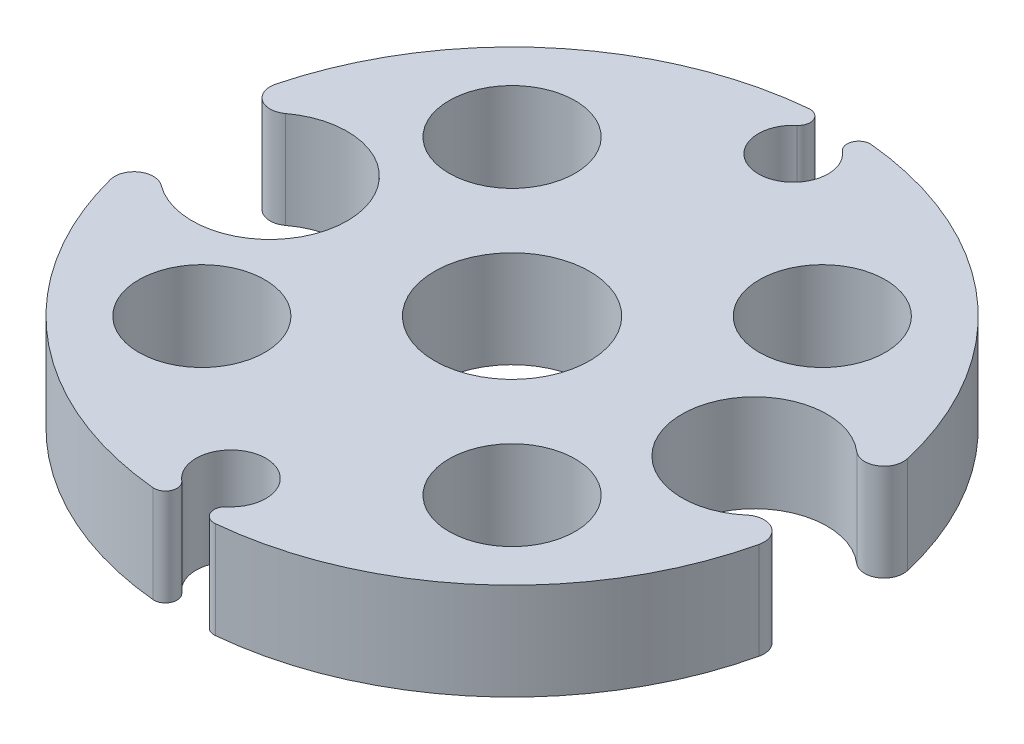
ISO-10303-21;
HEADER;
FILE_DESCRIPTION(('STEP AP214'),'2;1');
FILE_NAME('part.step','',(''),(''),'','','');
FILE_SCHEMA(('AUTOMOTIVE_DESIGN { 1 0 10303 214 1 1 1 1 }'));
ENDSEC;
DATA;
#1=APPLICATION_CONTEXT('core data for automotive mechanical design processes');
#2=APPLICATION_PROTOCOL_DEFINITION('international standard','automotive_design',2000,#1);
#3=PRODUCT_CONTEXT('',#1,'mechanical');
#4=PRODUCT('Part','Part','',(#3));
#5=PRODUCT_RELATED_PRODUCT_CATEGORY('part','',(#4));
#6=PRODUCT_DEFINITION_FORMATION('','',#4);
#7=PRODUCT_DEFINITION_CONTEXT('part definition',#1,'design');
#8=PRODUCT_DEFINITION('design','',#6,#7);
#9=PRODUCT_DEFINITION_SHAPE('','',#8);
#10=(LENGTH_UNIT() NAMED_UNIT(*) SI_UNIT(.MILLI.,.METRE.));
#11=(NAMED_UNIT(*) PLANE_ANGLE_UNIT() SI_UNIT($,.RADIAN.));
#12=(NAMED_UNIT(*) SI_UNIT($,.STERADIAN.) SOLID_ANGLE_UNIT());
#13=UNCERTAINTY_MEASURE_WITH_UNIT(LENGTH_MEASURE(1.E-05),#10,'distance_accuracy_value','');
#14=(GEOMETRIC_REPRESENTATION_CONTEXT(3) GLOBAL_UNCERTAINTY_ASSIGNED_CONTEXT((#13)) GLOBAL_UNIT_ASSIGNED_CONTEXT((#10,
#11,#12)) REPRESENTATION_CONTEXT('',''));
#15=CARTESIAN_POINT('',(0.,0.,0.));
#16=DIRECTION('',(0.,0.,1.));
#17=DIRECTION('',(1.,0.,0.));
#18=AXIS2_PLACEMENT_3D('',#15,#16,#17);
#19=CARTESIAN_POINT('',(90.5251235922764,5.,-81.0968706266902));
#20=DIRECTION('',(0.,-1.,0.));
#21=DIRECTION('',(0.,0.,-1.));
#22=AXIS2_PLACEMENT_3D('',#19,#20,#21);
#23=CYLINDRICAL_SURFACE('',#22,0.599999999999982);
#24=CARTESIAN_POINT('',(90.5251235922764,0.,-81.0968706266902));
#25=DIRECTION('',(0.,1.,0.));
#26=DIRECTION('',(0.,0.,1.));
#27=AXIS2_PLACEMENT_3D('',#24,#25,#26);
#28=CIRCLE('',#27,0.599999999999982);
#29=CARTESIAN_POINT('',(90.1357147690975,0.,-81.5533361439316));
#30=VERTEX_POINT('',#29);
#31=CARTESIAN_POINT('',(90.5821102493269,0.,-80.4995829900207));
#32=VERTEX_POINT('',#31);
#33=EDGE_CURVE('E196',#30,#32,#28,.T.);
#34=ORIENTED_EDGE('',*,*,#33,.T.);
#35=DIRECTION('',(0.,-1.,0.));
#36=VECTOR('',#35,1.);
#37=CARTESIAN_POINT('',(90.5821102493269,5.,-80.4995829900207));
#38=LINE('',#37,#36);
#39=CARTESIAN_POINT('',(90.5821102493269,5.,-80.4995829900207));
#40=VERTEX_POINT('',#39);
#41=EDGE_CURVE('E11',#40,#32,#38,.T.);
#42=ORIENTED_EDGE('',*,*,#41,.F.);
#43=CARTESIAN_POINT('',(90.5251235922764,5.,-81.0968706266902));
#44=DIRECTION('',(0.,1.,0.));
#45=DIRECTION('',(0.,0.,1.));
#46=AXIS2_PLACEMENT_3D('',#43,#44,#45);
#47=CIRCLE('',#46,0.599999999999982);
#48=CARTESIAN_POINT('',(90.1357147690975,5.,-81.5533361439316));
#49=VERTEX_POINT('',#48);
#50=EDGE_CURVE('E284',#49,#40,#47,.T.);
#51=ORIENTED_EDGE('',*,*,#50,.F.);
#52=DIRECTION('',(0.,-1.,0.));
#53=VECTOR('',#52,1.);
#54=CARTESIAN_POINT('',(90.1357147690975,5.,-81.5533361439316));
#55=LINE('',#54,#53);
#56=EDGE_CURVE('E51',#49,#30,#55,.T.);
#57=ORIENTED_EDGE('',*,*,#56,.T.);
#58=EDGE_LOOP('',(#34,#42,#51,#57));
#59=FACE_BOUND('',#58,.T.);
#60=ADVANCED_FACE('F34',(#59),#23,.T.);
#61=CARTESIAN_POINT('',(88.9674882995609,5.,-97.4227326956557));
#62=DIRECTION('',(0.,-1.,0.));
#63=DIRECTION('',(0.,0.,-1.));
#64=AXIS2_PLACEMENT_3D('',#61,#62,#63);
#65=CYLINDRICAL_SURFACE('',#64,17.);
#66=CARTESIAN_POINT('',(88.9674882995609,0.,-97.4227326956557));
#67=DIRECTION('',(0.,1.,0.));
#68=DIRECTION('',(0.,0.,1.));
#69=AXIS2_PLACEMENT_3D('',#66,#67,#68);
#70=CIRCLE('',#69,17.);
#71=CARTESIAN_POINT('',(105.532711055206,0.,-93.6026024549645));
#72=VERTEX_POINT('',#71);
#73=EDGE_CURVE('E198',#32,#72,#70,.T.);
#74=ORIENTED_EDGE('',*,*,#73,.T.);
#75=DIRECTION('',(0.,-1.,0.));
#76=VECTOR('',#75,1.);
#77=CARTESIAN_POINT('',(105.532711055206,5.,-93.6026024549645));
#78=LINE('',#77,#76);
#79=CARTESIAN_POINT('',(105.532711055206,5.,-93.6026024549645));
#80=VERTEX_POINT('',#79);
#81=EDGE_CURVE('E43',#80,#72,#78,.T.);
#82=ORIENTED_EDGE('',*,*,#81,.F.);
#83=CARTESIAN_POINT('',(88.9674882995609,5.,-97.4227326956557));
#84=DIRECTION('',(0.,1.,0.));
#85=DIRECTION('',(0.,0.,1.));
#86=AXIS2_PLACEMENT_3D('',#83,#84,#85);
#87=CIRCLE('',#86,17.);
#88=EDGE_CURVE('E114',#40,#80,#87,.T.);
#89=ORIENTED_EDGE('',*,*,#88,.F.);
#90=ORIENTED_EDGE('',*,*,#41,.T.);
#91=EDGE_LOOP('',(#74,#82,#89,#90));
#92=FACE_BOUND('',#91,.T.);
#93=ADVANCED_FACE('F268',(#92),#65,.T.);
#94=CARTESIAN_POINT('',(104.558286187227,5.,-93.8273159985346));
#95=DIRECTION('',(0.,-1.,0.));
#96=DIRECTION('',(0.,0.,-1.));
#97=AXIS2_PLACEMENT_3D('',#94,#95,#96);
#98=CYLINDRICAL_SURFACE('',#97,1.);
#99=CARTESIAN_POINT('',(104.558286187227,0.,-93.8273159985346));
#100=DIRECTION('',(0.,1.,0.));
#101=DIRECTION('',(0.,0.,1.));
#102=AXIS2_PLACEMENT_3D('',#99,#100,#101);
#103=CIRCLE('',#102,1.);
#104=CARTESIAN_POINT('',(103.906399753367,0.,-94.5856326061263));
#105=VERTEX_POINT('',#104);
#106=EDGE_CURVE('E201',#105,#72,#103,.F.);
#107=ORIENTED_EDGE('',*,*,#106,.F.);
#108=DIRECTION('',(0.,-1.,0.));
#109=VECTOR('',#108,1.);
#110=CARTESIAN_POINT('',(103.906399753367,5.,-94.5856326061263));
#111=LINE('',#110,#109);
#112=CARTESIAN_POINT('',(103.906399753367,5.,-94.5856326061263));
#113=VERTEX_POINT('',#112);
#114=EDGE_CURVE('E261',#113,#105,#111,.T.);
#115=ORIENTED_EDGE('',*,*,#114,.F.);
#116=CARTESIAN_POINT('',(104.558286187227,5.,-93.8273159985346));
#117=DIRECTION('',(0.,1.,0.));
#118=DIRECTION('',(0.,0.,1.));
#119=AXIS2_PLACEMENT_3D('',#116,#117,#118);
#120=CIRCLE('',#119,1.);
#121=EDGE_CURVE('E267',#113,#80,#120,.F.);
#122=ORIENTED_EDGE('',*,*,#121,.T.);
#123=ORIENTED_EDGE('',*,*,#81,.T.);
#124=EDGE_LOOP('',(#107,#115,#122,#123));
#125=FACE_BOUND('',#124,.T.);
#126=ADVANCED_FACE('F265',(#125),#98,.T.);
#127=CARTESIAN_POINT('',(101.467488299561,5.,-97.4227326956558));
#128=DIRECTION('',(0.,-1.,0.));
#129=DIRECTION('',(0.,0.,-1.));
#130=AXIS2_PLACEMENT_3D('',#127,#128,#129);
#131=CYLINDRICAL_SURFACE('',#130,3.74131340541217);
#132=CARTESIAN_POINT('',(101.467488299561,0.,-97.4227326956558));
#133=DIRECTION('',(0.,1.,0.));
#134=DIRECTION('',(0.,0.,1.));
#135=AXIS2_PLACEMENT_3D('',#132,#133,#134);
#136=CIRCLE('',#135,3.74131340541217);
#137=CARTESIAN_POINT('',(103.906399753367,0.,-100.259832785185));
#138=VERTEX_POINT('',#137);
#139=EDGE_CURVE('E204',#138,#105,#136,.T.);
#140=ORIENTED_EDGE('',*,*,#139,.F.);
#141=DIRECTION('',(0.,-1.,0.));
#142=VECTOR('',#141,1.);
#143=CARTESIAN_POINT('',(103.906399753367,5.,-100.259832785185));
#144=LINE('',#143,#142);
#145=CARTESIAN_POINT('',(103.906399753367,5.,-100.259832785185));
#146=VERTEX_POINT('',#145);
#147=EDGE_CURVE('E259',#146,#138,#144,.T.);
#148=ORIENTED_EDGE('',*,*,#147,.F.);
#149=CARTESIAN_POINT('',(101.467488299561,5.,-97.4227326956558));
#150=DIRECTION('',(0.,1.,0.));
#151=DIRECTION('',(0.,0.,1.));
#152=AXIS2_PLACEMENT_3D('',#149,#150,#151);
#153=CIRCLE('',#152,3.74131340541217);
#154=EDGE_CURVE('E280',#146,#113,#153,.T.);
#155=ORIENTED_EDGE('',*,*,#154,.T.);
#156=ORIENTED_EDGE('',*,*,#114,.T.);
#157=EDGE_LOOP('',(#140,#148,#155,#156));
#158=FACE_BOUND('',#157,.T.);
#159=ADVANCED_FACE('F276',(#158),#131,.F.);
#160=CARTESIAN_POINT('',(104.558286187227,5.,-101.018149392777));
#161=DIRECTION('',(0.,-1.,0.));
#162=DIRECTION('',(0.,0.,-1.));
#163=AXIS2_PLACEMENT_3D('',#160,#161,#162);
#164=CYLINDRICAL_SURFACE('',#163,0.999999999999882);
#165=CARTESIAN_POINT('',(104.558286187227,0.,-101.018149392777));
#166=DIRECTION('',(0.,1.,0.));
#167=DIRECTION('',(0.,0.,1.));
#168=AXIS2_PLACEMENT_3D('',#165,#166,#167);
#169=CIRCLE('',#168,0.999999999999882);
#170=CARTESIAN_POINT('',(105.532711055206,0.,-101.242862936347));
#171=VERTEX_POINT('',#170);
#172=EDGE_CURVE('E207',#138,#171,#169,.T.);
#173=ORIENTED_EDGE('',*,*,#172,.T.);
#174=DIRECTION('',(0.,-1.,0.));
#175=VECTOR('',#174,1.);
#176=CARTESIAN_POINT('',(105.532711055206,5.,-101.242862936347));
#177=LINE('',#176,#175);
#178=CARTESIAN_POINT('',(105.532711055206,5.,-101.242862936347));
#179=VERTEX_POINT('',#178);
#180=EDGE_CURVE('E256',#179,#171,#177,.T.);
#181=ORIENTED_EDGE('',*,*,#180,.F.);
#182=CARTESIAN_POINT('',(104.558286187227,5.,-101.018149392777));
#183=DIRECTION('',(0.,1.,0.));
#184=DIRECTION('',(0.,0.,1.));
#185=AXIS2_PLACEMENT_3D('',#182,#183,#184);
#186=CIRCLE('',#185,0.999999999999882);
#187=EDGE_CURVE('E282',#146,#179,#186,.T.);
#188=ORIENTED_EDGE('',*,*,#187,.F.);
#189=ORIENTED_EDGE('',*,*,#147,.T.);
#190=EDGE_LOOP('',(#173,#181,#188,#189));
#191=FACE_BOUND('',#190,.T.);
#192=ADVANCED_FACE('F495',(#191),#164,.T.);
#193=CARTESIAN_POINT('',(88.9674882995609,5.,-97.4227326956557));
#194=DIRECTION('',(0.,-1.,0.));
#195=DIRECTION('',(0.,0.,-1.));
#196=AXIS2_PLACEMENT_3D('',#193,#194,#195);
#197=CYLINDRICAL_SURFACE('',#196,17.);
#198=CARTESIAN_POINT('',(88.9674882995609,0.,-97.4227326956557));
#199=DIRECTION('',(0.,1.,0.));
#200=DIRECTION('',(0.,0.,1.));
#201=AXIS2_PLACEMENT_3D('',#198,#199,#200);
#202=CIRCLE('',#201,17.);
#203=CARTESIAN_POINT('',(90.5702736876257,0.,-114.34700753979));
#204=VERTEX_POINT('',#203);
#205=EDGE_CURVE('E209',#171,#204,#202,.T.);
#206=ORIENTED_EDGE('',*,*,#205,.T.);
#207=DIRECTION('',(0.,-1.,0.));
#208=VECTOR('',#207,1.);
#209=CARTESIAN_POINT('',(90.5702736876257,5.,-114.34700753979));
#210=LINE('',#209,#208);
#211=CARTESIAN_POINT('',(90.5702736876257,5.,-114.34700753979));
#212=VERTEX_POINT('',#211);
#213=EDGE_CURVE('E253',#212,#204,#210,.T.);
#214=ORIENTED_EDGE('',*,*,#213,.F.);
#215=CARTESIAN_POINT('',(88.9674882995609,5.,-97.4227326956557));
#216=DIRECTION('',(0.,1.,0.));
#217=DIRECTION('',(0.,0.,1.));
#218=AXIS2_PLACEMENT_3D('',#215,#216,#217);
#219=CIRCLE('',#218,17.);
#220=EDGE_CURVE('E289',#179,#212,#219,.T.);
#221=ORIENTED_EDGE('',*,*,#220,.F.);
#222=ORIENTED_EDGE('',*,*,#180,.T.);
#223=EDGE_LOOP('',(#206,#214,#221,#222));
#224=FACE_BOUND('',#223,.T.);
#225=ADVANCED_FACE('F486',(#224),#197,.T.);
#226=CARTESIAN_POINT('',(90.5140447705068,5.,-113.753270128286));
#227=DIRECTION('',(0.,-1.,0.));
#228=DIRECTION('',(0.,0.,-1.));
#229=AXIS2_PLACEMENT_3D('',#226,#227,#228);
#230=CYLINDRICAL_SURFACE('',#229,0.596394001428948);
#231=CARTESIAN_POINT('',(90.5140447705068,0.,-113.753270128286));
#232=DIRECTION('',(0.,1.,0.));
#233=DIRECTION('',(0.,0.,1.));
#234=AXIS2_PLACEMENT_3D('',#231,#232,#233);
#235=CIRCLE('',#234,0.596394001428948);
#236=CARTESIAN_POINT('',(90.1291510503618,0.,-113.297701660179));
#237=VERTEX_POINT('',#236);
#238=EDGE_CURVE('E211',#204,#237,#235,.T.);
#239=ORIENTED_EDGE('',*,*,#238,.T.);
#240=DIRECTION('',(0.,-1.,0.));
#241=VECTOR('',#240,1.);
#242=CARTESIAN_POINT('',(90.1291510503618,5.,-113.297701660179));
#243=LINE('',#242,#241);
#244=CARTESIAN_POINT('',(90.1291510503618,5.,-113.297701660179));
#245=VERTEX_POINT('',#244);
#246=EDGE_CURVE('E251',#245,#237,#243,.T.);
#247=ORIENTED_EDGE('',*,*,#246,.F.);
#248=CARTESIAN_POINT('',(90.5140447705068,5.,-113.753270128286));
#249=DIRECTION('',(0.,1.,0.));
#250=DIRECTION('',(0.,0.,1.));
#251=AXIS2_PLACEMENT_3D('',#248,#249,#250);
#252=CIRCLE('',#251,0.596394001428948);
#253=EDGE_CURVE('E291',#212,#245,#252,.T.);
#254=ORIENTED_EDGE('',*,*,#253,.F.);
#255=ORIENTED_EDGE('',*,*,#213,.T.);
#256=EDGE_LOOP('',(#239,#247,#254,#255));
#257=FACE_BOUND('',#256,.T.);
#258=ADVANCED_FACE('F477',(#257),#230,.T.);
#259=CARTESIAN_POINT('',(88.9674882995609,5.,-111.922732695656));
#260=DIRECTION('',(0.,-1.,0.));
#261=DIRECTION('',(0.,0.,-1.));
#262=AXIS2_PLACEMENT_3D('',#259,#260,#261);
#263=CYLINDRICAL_SURFACE('',#262,1.8);
#264=CARTESIAN_POINT('',(88.9674882995609,0.,-111.922732695656));
#265=DIRECTION('',(0.,1.,0.));
#266=DIRECTION('',(0.,0.,1.));
#267=AXIS2_PLACEMENT_3D('',#264,#265,#266);
#268=CIRCLE('',#267,1.8);
#269=CARTESIAN_POINT('',(87.7992618300242,0.,-113.29212924738));
#270=VERTEX_POINT('',#269);
#271=EDGE_CURVE('E214',#270,#237,#268,.T.);
#272=ORIENTED_EDGE('',*,*,#271,.F.);
#273=DIRECTION('',(0.,-1.,0.));
#274=VECTOR('',#273,1.);
#275=CARTESIAN_POINT('',(87.7992618300242,5.,-113.29212924738));
#276=LINE('',#275,#274);
#277=CARTESIAN_POINT('',(87.7992618300242,5.,-113.29212924738));
#278=VERTEX_POINT('',#277);
#279=EDGE_CURVE('E249',#278,#270,#276,.T.);
#280=ORIENTED_EDGE('',*,*,#279,.F.);
#281=CARTESIAN_POINT('',(88.9674882995609,5.,-111.922732695656));
#282=DIRECTION('',(0.,1.,0.));
#283=DIRECTION('',(0.,0.,1.));
#284=AXIS2_PLACEMENT_3D('',#281,#282,#283);
#285=CIRCLE('',#284,1.8);
#286=EDGE_CURVE('E293',#278,#245,#285,.T.);
#287=ORIENTED_EDGE('',*,*,#286,.T.);
#288=ORIENTED_EDGE('',*,*,#246,.T.);
#289=EDGE_LOOP('',(#272,#280,#287,#288));
#290=FACE_BOUND('',#289,.T.);
#291=ADVANCED_FACE('F468',(#290),#263,.F.);
#292=CARTESIAN_POINT('',(87.4098530068454,5.,-113.748594764621));
#293=DIRECTION('',(0.,-1.,0.));
#294=DIRECTION('',(0.,0.,-1.));
#295=AXIS2_PLACEMENT_3D('',#292,#293,#294);
#296=CYLINDRICAL_SURFACE('',#295,0.600000000000002);
#297=CARTESIAN_POINT('',(87.4098530068454,0.,-113.748594764621));
#298=DIRECTION('',(0.,1.,0.));
#299=DIRECTION('',(0.,0.,1.));
#300=AXIS2_PLACEMENT_3D('',#297,#298,#299);
#301=CIRCLE('',#300,0.600000000000002);
#302=CARTESIAN_POINT('',(87.3528663497948,0.,-114.345882401291));
#303=VERTEX_POINT('',#302);
#304=EDGE_CURVE('E217',#270,#303,#301,.T.);
#305=ORIENTED_EDGE('',*,*,#304,.T.);
#306=DIRECTION('',(0.,-1.,0.));
#307=VECTOR('',#306,1.);
#308=CARTESIAN_POINT('',(87.3528663497948,5.,-114.345882401291));
#309=LINE('',#308,#307);
#310=CARTESIAN_POINT('',(87.3528663497948,5.,-114.345882401291));
#311=VERTEX_POINT('',#310);
#312=EDGE_CURVE('E246',#311,#303,#309,.T.);
#313=ORIENTED_EDGE('',*,*,#312,.F.);
#314=CARTESIAN_POINT('',(87.4098530068454,5.,-113.748594764621));
#315=DIRECTION('',(0.,1.,0.));
#316=DIRECTION('',(0.,0.,1.));
#317=AXIS2_PLACEMENT_3D('',#314,#315,#316);
#318=CIRCLE('',#317,0.600000000000002);
#319=EDGE_CURVE('E296',#278,#311,#318,.T.);
#320=ORIENTED_EDGE('',*,*,#319,.F.);
#321=ORIENTED_EDGE('',*,*,#279,.T.);
#322=EDGE_LOOP('',(#305,#313,#320,#321));
#323=FACE_BOUND('',#322,.T.);
#324=ADVANCED_FACE('F459',(#323),#296,.T.);
#325=CARTESIAN_POINT('',(88.9674882995609,5.,-97.4227326956557));
#326=DIRECTION('',(0.,-1.,0.));
#327=DIRECTION('',(0.,0.,-1.));
#328=AXIS2_PLACEMENT_3D('',#325,#326,#327);
#329=CYLINDRICAL_SURFACE('',#328,17.);
#330=CARTESIAN_POINT('',(88.9674882995609,0.,-97.4227326956557));
#331=DIRECTION('',(0.,1.,0.));
#332=DIRECTION('',(0.,0.,1.));
#333=AXIS2_PLACEMENT_3D('',#330,#331,#332);
#334=CIRCLE('',#333,17.);
#335=CARTESIAN_POINT('',(72.509363299561,0.,-101.68068073249));
#336=VERTEX_POINT('',#335);
#337=EDGE_CURVE('E219',#303,#336,#334,.T.);
#338=ORIENTED_EDGE('',*,*,#337,.T.);
#339=DIRECTION('',(0.,-1.,0.));
#340=VECTOR('',#339,1.);
#341=CARTESIAN_POINT('',(72.509363299561,5.,-101.68068073249));
#342=LINE('',#341,#340);
#343=CARTESIAN_POINT('',(72.509363299561,5.,-101.68068073249));
#344=VERTEX_POINT('',#343);
#345=EDGE_CURVE('E244',#344,#336,#342,.T.);
#346=ORIENTED_EDGE('',*,*,#345,.F.);
#347=CARTESIAN_POINT('',(88.9674882995609,5.,-97.4227326956557));
#348=DIRECTION('',(0.,1.,0.));
#349=DIRECTION('',(0.,0.,1.));
#350=AXIS2_PLACEMENT_3D('',#347,#348,#349);
#351=CIRCLE('',#350,17.);
#352=EDGE_CURVE('E298',#311,#344,#351,.T.);
#353=ORIENTED_EDGE('',*,*,#352,.F.);
#354=ORIENTED_EDGE('',*,*,#312,.T.);
#355=EDGE_LOOP('',(#338,#346,#353,#354));
#356=FACE_BOUND('',#355,.T.);
#357=ADVANCED_FACE('F451',(#356),#329,.T.);
#358=CARTESIAN_POINT('',(73.4774882995613,5.,-101.430213200911));
#359=DIRECTION('',(0.,-1.,0.));
#360=DIRECTION('',(0.,0.,-1.));
#361=AXIS2_PLACEMENT_3D('',#358,#359,#360);
#362=CYLINDRICAL_SURFACE('',#361,1.00000000000026);
#363=CARTESIAN_POINT('',(73.4774882995613,0.,-101.430213200911));
#364=DIRECTION('',(0.,1.,0.));
#365=DIRECTION('',(0.,0.,1.));
#366=AXIS2_PLACEMENT_3D('',#363,#364,#365);
#367=CIRCLE('',#366,1.00000000000026);
#368=CARTESIAN_POINT('',(74.0754882995613,0.,-100.62871709986));
#369=VERTEX_POINT('',#368);
#370=EDGE_CURVE('E222',#369,#336,#367,.F.);
#371=ORIENTED_EDGE('',*,*,#370,.F.);
#372=DIRECTION('',(0.,-1.,0.));
#373=VECTOR('',#372,1.);
#374=CARTESIAN_POINT('',(74.0754882995613,5.,-100.62871709986));
#375=LINE('',#374,#373);
#376=CARTESIAN_POINT('',(74.0754882995613,5.,-100.62871709986));
#377=VERTEX_POINT('',#376);
#378=EDGE_CURVE('E242',#377,#369,#375,.T.);
#379=ORIENTED_EDGE('',*,*,#378,.F.);
#380=CARTESIAN_POINT('',(73.4774882995613,5.,-101.430213200911));
#381=DIRECTION('',(0.,1.,0.));
#382=DIRECTION('',(0.,0.,1.));
#383=AXIS2_PLACEMENT_3D('',#380,#381,#382);
#384=CIRCLE('',#383,1.00000000000026);
#385=EDGE_CURVE('E300',#377,#344,#384,.F.);
#386=ORIENTED_EDGE('',*,*,#385,.T.);
#387=ORIENTED_EDGE('',*,*,#345,.T.);
#388=EDGE_LOOP('',(#371,#379,#386,#387));
#389=FACE_BOUND('',#388,.T.);
#390=ADVANCED_FACE('F313',(#389),#362,.T.);
#391=CARTESIAN_POINT('',(76.4674882995608,5.,-97.4227326956557));
#392=DIRECTION('',(0.,-1.,0.));
#393=DIRECTION('',(0.,0.,-1.));
#394=AXIS2_PLACEMENT_3D('',#391,#392,#393);
#395=CYLINDRICAL_SURFACE('',#394,3.99999999999998);
#396=CARTESIAN_POINT('',(76.4674882995608,0.,-97.4227326956557));
#397=DIRECTION('',(0.,1.,0.));
#398=DIRECTION('',(0.,0.,1.));
#399=AXIS2_PLACEMENT_3D('',#396,#397,#398);
#400=CIRCLE('',#399,3.99999999999998);
#401=CARTESIAN_POINT('',(74.0754882995617,0.,-94.216748291451));
#402=VERTEX_POINT('',#401);
#403=EDGE_CURVE('E225',#402,#369,#400,.T.);
#404=ORIENTED_EDGE('',*,*,#403,.F.);
#405=DIRECTION('',(0.,-1.,0.));
#406=VECTOR('',#405,1.);
#407=CARTESIAN_POINT('',(74.0754882995617,5.,-94.216748291451));
#408=LINE('',#407,#406);
#409=CARTESIAN_POINT('',(74.0754882995617,5.,-94.216748291451));
#410=VERTEX_POINT('',#409);
#411=EDGE_CURVE('E240',#410,#402,#408,.T.);
#412=ORIENTED_EDGE('',*,*,#411,.F.);
#413=CARTESIAN_POINT('',(76.4674882995608,5.,-97.4227326956557));
#414=DIRECTION('',(0.,1.,0.));
#415=DIRECTION('',(0.,0.,1.));
#416=AXIS2_PLACEMENT_3D('',#413,#414,#415);
#417=CIRCLE('',#416,3.99999999999998);
#418=EDGE_CURVE('E303',#410,#377,#417,.T.);
#419=ORIENTED_EDGE('',*,*,#418,.T.);
#420=ORIENTED_EDGE('',*,*,#378,.T.);
#421=EDGE_LOOP('',(#404,#412,#419,#420));
#422=FACE_BOUND('',#421,.T.);
#423=ADVANCED_FACE('F307',(#422),#395,.F.);
#424=CARTESIAN_POINT('',(73.4774882995616,5.,-93.4152521903994));
#425=DIRECTION('',(0.,-1.,0.));
#426=DIRECTION('',(0.,0.,-1.));
#427=AXIS2_PLACEMENT_3D('',#424,#425,#426);
#428=CYLINDRICAL_SURFACE('',#427,1.00000000000045);
#429=CARTESIAN_POINT('',(73.4774882995616,0.,-93.4152521903994));
#430=DIRECTION('',(0.,1.,0.));
#431=DIRECTION('',(0.,0.,1.));
#432=AXIS2_PLACEMENT_3D('',#429,#430,#431);
#433=CIRCLE('',#432,1.00000000000045);
#434=CARTESIAN_POINT('',(72.5093632995612,0.,-93.1647846588208));
#435=VERTEX_POINT('',#434);
#436=EDGE_CURVE('E228',#402,#435,#433,.T.);
#437=ORIENTED_EDGE('',*,*,#436,.T.);
#438=DIRECTION('',(0.,-1.,0.));
#439=VECTOR('',#438,1.);
#440=CARTESIAN_POINT('',(72.5093632995612,5.,-93.1647846588208));
#441=LINE('',#440,#439);
#442=CARTESIAN_POINT('',(72.5093632995612,5.,-93.1647846588208));
#443=VERTEX_POINT('',#442);
#444=EDGE_CURVE('E173',#443,#435,#441,.T.);
#445=ORIENTED_EDGE('',*,*,#444,.F.);
#446=CARTESIAN_POINT('',(73.4774882995616,5.,-93.4152521903994));
#447=DIRECTION('',(0.,1.,0.));
#448=DIRECTION('',(0.,0.,1.));
#449=AXIS2_PLACEMENT_3D('',#446,#447,#448);
#450=CIRCLE('',#449,1.00000000000045);
#451=EDGE_CURVE('E161',#410,#443,#450,.T.);
#452=ORIENTED_EDGE('',*,*,#451,.F.);
#453=ORIENTED_EDGE('',*,*,#411,.T.);
#454=EDGE_LOOP('',(#437,#445,#452,#453));
#455=FACE_BOUND('',#454,.T.);
#456=ADVANCED_FACE('F317',(#455),#428,.T.);
#457=CARTESIAN_POINT('',(88.9674882995609,5.,-97.4227326956557));
#458=DIRECTION('',(0.,-1.,0.));
#459=DIRECTION('',(0.,0.,-1.));
#460=AXIS2_PLACEMENT_3D('',#457,#458,#459);
#461=CYLINDRICAL_SURFACE('',#460,17.);
#462=CARTESIAN_POINT('',(88.9674882995609,0.,-97.4227326956557));
#463=DIRECTION('',(0.,1.,0.));
#464=DIRECTION('',(0.,0.,1.));
#465=AXIS2_PLACEMENT_3D('',#462,#463,#464);
#466=CIRCLE('',#465,17.);
#467=CARTESIAN_POINT('',(87.3647029114961,0.,-80.4984578515212));
#468=VERTEX_POINT('',#467);
#469=EDGE_CURVE('E170',#435,#468,#466,.T.);
#470=ORIENTED_EDGE('',*,*,#469,.T.);
#471=DIRECTION('',(0.,-1.,0.));
#472=VECTOR('',#471,1.);
#473=CARTESIAN_POINT('',(87.3647029114961,5.,-80.4984578515212));
#474=LINE('',#473,#472);
#475=CARTESIAN_POINT('',(87.3647029114961,5.,-80.4984578515212));
#476=VERTEX_POINT('',#475);
#477=EDGE_CURVE('E167',#476,#468,#474,.T.);
#478=ORIENTED_EDGE('',*,*,#477,.F.);
#479=CARTESIAN_POINT('',(88.9674882995609,5.,-97.4227326956557));
#480=DIRECTION('',(0.,1.,0.));
#481=DIRECTION('',(0.,0.,1.));
#482=AXIS2_PLACEMENT_3D('',#479,#480,#481);
#483=CIRCLE('',#482,17.);
#484=EDGE_CURVE('E153',#443,#476,#483,.T.);
#485=ORIENTED_EDGE('',*,*,#484,.F.);
#486=ORIENTED_EDGE('',*,*,#444,.T.);
#487=EDGE_LOOP('',(#470,#478,#485,#486));
#488=FACE_BOUND('',#487,.T.);
#489=ADVANCED_FACE('F168',(#488),#461,.T.);
#490=CARTESIAN_POINT('',(87.4209318286149,5.,-81.0921952630257));
#491=DIRECTION('',(0.,-1.,0.));
#492=DIRECTION('',(0.,0.,-1.));
#493=AXIS2_PLACEMENT_3D('',#490,#491,#492);
#494=CYLINDRICAL_SURFACE('',#493,0.596394001428961);
#495=CARTESIAN_POINT('',(87.4209318286149,0.,-81.0921952630257));
#496=DIRECTION('',(0.,1.,0.));
#497=DIRECTION('',(0.,0.,1.));
#498=AXIS2_PLACEMENT_3D('',#495,#496,#497);
#499=CIRCLE('',#498,0.596394001428961);
#500=CARTESIAN_POINT('',(87.80582554876,0.,-81.5477637311327));
#501=VERTEX_POINT('',#500);
#502=EDGE_CURVE('E231',#468,#501,#499,.T.);
#503=ORIENTED_EDGE('',*,*,#502,.T.);
#504=DIRECTION('',(0.,-1.,0.));
#505=VECTOR('',#504,1.);
#506=CARTESIAN_POINT('',(87.80582554876,5.,-81.5477637311327));
#507=LINE('',#506,#505);
#508=CARTESIAN_POINT('',(87.80582554876,5.,-81.5477637311327));
#509=VERTEX_POINT('',#508);
#510=EDGE_CURVE('E102',#509,#501,#507,.T.);
#511=ORIENTED_EDGE('',*,*,#510,.F.);
#512=CARTESIAN_POINT('',(87.4209318286149,5.,-81.0921952630257));
#513=DIRECTION('',(0.,1.,0.));
#514=DIRECTION('',(0.,0.,1.));
#515=AXIS2_PLACEMENT_3D('',#512,#513,#514);
#516=CIRCLE('',#515,0.596394001428961);
#517=EDGE_CURVE('E158',#476,#509,#516,.T.);
#518=ORIENTED_EDGE('',*,*,#517,.F.);
#519=ORIENTED_EDGE('',*,*,#477,.T.);
#520=EDGE_LOOP('',(#503,#511,#518,#519));
#521=FACE_BOUND('',#520,.T.);
#522=ADVANCED_FACE('F175',(#521),#494,.T.);
#523=CARTESIAN_POINT('',(88.9674882995609,5.,-97.4227326956557));
#524=DIRECTION('',(0.,-1.,0.));
#525=DIRECTION('',(0.,0.,-1.));
#526=AXIS2_PLACEMENT_3D('',#523,#524,#525);
#527=CYLINDRICAL_SURFACE('',#526,3.99999999999929);
#528=CARTESIAN_POINT('',(88.9674882995609,5.,-97.4227326956557));
#529=DIRECTION('',(0.,1.,0.));
#530=DIRECTION('',(0.,0.,1.));
#531=AXIS2_PLACEMENT_3D('',#528,#529,#530);
#532=CIRCLE('',#531,3.99999999999929);
#533=CARTESIAN_POINT('',(88.9674882995609,5.,-93.4227326956565));
#534=VERTEX_POINT('',#533);
#535=EDGE_CURVE('E550',#534,#534,#532,.T.);
#536=ORIENTED_EDGE('',*,*,#535,.T.);
#537=EDGE_LOOP('',(#536));
#538=FACE_BOUND('',#537,.T.);
#539=CARTESIAN_POINT('',(88.9674882995609,0.,-97.4227326956557));
#540=DIRECTION('',(0.,1.,0.));
#541=DIRECTION('',(0.,0.,1.));
#542=AXIS2_PLACEMENT_3D('',#539,#540,#541);
#543=CIRCLE('',#542,3.99999999999929);
#544=CARTESIAN_POINT('',(88.9674882995609,0.,-93.4227326956565));
#545=VERTEX_POINT('',#544);
#546=EDGE_CURVE('E193',#545,#545,#543,.T.);
#547=ORIENTED_EDGE('',*,*,#546,.F.);
#548=EDGE_LOOP('',(#547));
#549=FACE_BOUND('',#548,.T.);
#550=ADVANCED_FACE('F334',(#538,#549),#527,.F.);
#551=CARTESIAN_POINT('',(80.9674882995608,5.,-89.4227326956557));
#552=DIRECTION('',(0.,-1.,0.));
#553=DIRECTION('',(0.,0.,-1.));
#554=AXIS2_PLACEMENT_3D('',#551,#552,#553);
#555=CYLINDRICAL_SURFACE('',#554,3.25000000000016);
#556=CARTESIAN_POINT('',(80.9674882995608,5.,-89.4227326956557));
#557=DIRECTION('',(0.,1.,0.));
#558=DIRECTION('',(0.,0.,1.));
#559=AXIS2_PLACEMENT_3D('',#556,#557,#558);
#560=CIRCLE('',#559,3.25000000000016);
#561=CARTESIAN_POINT('',(80.9674882995608,5.,-86.1727326956555));
#562=VERTEX_POINT('',#561);
#563=EDGE_CURVE('E552',#562,#562,#560,.T.);
#564=ORIENTED_EDGE('',*,*,#563,.T.);
#565=EDGE_LOOP('',(#564));
#566=FACE_BOUND('',#565,.T.);
#567=CARTESIAN_POINT('',(80.9674882995608,0.,-89.4227326956557));
#568=DIRECTION('',(0.,1.,0.));
#569=DIRECTION('',(0.,0.,1.));
#570=AXIS2_PLACEMENT_3D('',#567,#568,#569);
#571=CIRCLE('',#570,3.25000000000016);
#572=CARTESIAN_POINT('',(80.9674882995608,0.,-86.1727326956555));
#573=VERTEX_POINT('',#572);
#574=EDGE_CURVE('E190',#573,#573,#571,.T.);
#575=ORIENTED_EDGE('',*,*,#574,.F.);
#576=EDGE_LOOP('',(#575));
#577=FACE_BOUND('',#576,.T.);
#578=ADVANCED_FACE('F337',(#566,#577),#555,.F.);
#579=CARTESIAN_POINT('',(80.9674882995609,5.,-105.422732695656));
#580=DIRECTION('',(0.,-1.,0.));
#581=DIRECTION('',(0.,0.,-1.));
#582=AXIS2_PLACEMENT_3D('',#579,#580,#581);
#583=CYLINDRICAL_SURFACE('',#582,3.25000000000002);
#584=CARTESIAN_POINT('',(80.9674882995609,5.,-105.422732695656));
#585=DIRECTION('',(0.,1.,0.));
#586=DIRECTION('',(0.,0.,1.));
#587=AXIS2_PLACEMENT_3D('',#584,#585,#586);
#588=CIRCLE('',#587,3.25000000000002);
#589=CARTESIAN_POINT('',(80.9674882995609,5.,-102.172732695656));
#590=VERTEX_POINT('',#589);
#591=EDGE_CURVE('E557',#590,#590,#588,.T.);
#592=ORIENTED_EDGE('',*,*,#591,.T.);
#593=EDGE_LOOP('',(#592));
#594=FACE_BOUND('',#593,.T.);
#595=CARTESIAN_POINT('',(80.9674882995609,0.,-105.422732695656));
#596=DIRECTION('',(0.,1.,0.));
#597=DIRECTION('',(0.,0.,1.));
#598=AXIS2_PLACEMENT_3D('',#595,#596,#597);
#599=CIRCLE('',#598,3.25000000000002);
#600=CARTESIAN_POINT('',(80.9674882995609,0.,-102.172732695656));
#601=VERTEX_POINT('',#600);
#602=EDGE_CURVE('E187',#601,#601,#599,.T.);
#603=ORIENTED_EDGE('',*,*,#602,.F.);
#604=EDGE_LOOP('',(#603));
#605=FACE_BOUND('',#604,.T.);
#606=ADVANCED_FACE('F341',(#594,#605),#583,.F.);
#607=CARTESIAN_POINT('',(96.967488299561,5.,-105.422732695656));
#608=DIRECTION('',(0.,-1.,0.));
#609=DIRECTION('',(0.,0.,-1.));
#610=AXIS2_PLACEMENT_3D('',#607,#608,#609);
#611=CYLINDRICAL_SURFACE('',#610,3.25000000000001);
#612=CARTESIAN_POINT('',(96.967488299561,5.,-105.422732695656));
#613=DIRECTION('',(0.,1.,0.));
#614=DIRECTION('',(0.,0.,1.));
#615=AXIS2_PLACEMENT_3D('',#612,#613,#614);
#616=CIRCLE('',#615,3.25000000000001);
#617=CARTESIAN_POINT('',(96.967488299561,5.,-102.172732695656));
#618=VERTEX_POINT('',#617);
#619=EDGE_CURVE('E356',#618,#618,#616,.T.);
#620=ORIENTED_EDGE('',*,*,#619,.T.);
#621=EDGE_LOOP('',(#620));
#622=FACE_BOUND('',#621,.T.);
#623=CARTESIAN_POINT('',(96.967488299561,0.,-105.422732695656));
#624=DIRECTION('',(0.,1.,0.));
#625=DIRECTION('',(0.,0.,1.));
#626=AXIS2_PLACEMENT_3D('',#623,#624,#625);
#627=CIRCLE('',#626,3.25000000000001);
#628=CARTESIAN_POINT('',(96.967488299561,0.,-102.172732695656));
#629=VERTEX_POINT('',#628);
#630=EDGE_CURVE('E184',#629,#629,#627,.T.);
#631=ORIENTED_EDGE('',*,*,#630,.F.);
#632=EDGE_LOOP('',(#631));
#633=FACE_BOUND('',#632,.T.);
#634=ADVANCED_FACE('F344',(#622,#633),#611,.F.);
#635=CARTESIAN_POINT('',(96.9674882995609,5.,-89.4227326956556));
#636=DIRECTION('',(0.,-1.,0.));
#637=DIRECTION('',(0.,0.,-1.));
#638=AXIS2_PLACEMENT_3D('',#635,#636,#637);
#639=CYLINDRICAL_SURFACE('',#638,3.25000000000002);
#640=CARTESIAN_POINT('',(96.9674882995609,5.,-89.4227326956556));
#641=DIRECTION('',(0.,1.,0.));
#642=DIRECTION('',(0.,0.,1.));
#643=AXIS2_PLACEMENT_3D('',#640,#641,#642);
#644=CIRCLE('',#643,3.25000000000002);
#645=CARTESIAN_POINT('',(96.9674882995609,5.,-86.1727326956556));
#646=VERTEX_POINT('',#645);
#647=EDGE_CURVE('E236',#646,#646,#644,.T.);
#648=ORIENTED_EDGE('',*,*,#647,.T.);
#649=EDGE_LOOP('',(#648));
#650=FACE_BOUND('',#649,.T.);
#651=CARTESIAN_POINT('',(96.9674882995609,0.,-89.4227326956556));
#652=DIRECTION('',(0.,1.,0.));
#653=DIRECTION('',(0.,0.,1.));
#654=AXIS2_PLACEMENT_3D('',#651,#652,#653);
#655=CIRCLE('',#654,3.25000000000002);
#656=CARTESIAN_POINT('',(96.9674882995609,0.,-86.1727326956556));
#657=VERTEX_POINT('',#656);
#658=EDGE_CURVE('E181',#657,#657,#655,.T.);
#659=ORIENTED_EDGE('',*,*,#658,.F.);
#660=EDGE_LOOP('',(#659));
#661=FACE_BOUND('',#660,.T.);
#662=ADVANCED_FACE('F36',(#650,#661),#639,.F.);
#663=CARTESIAN_POINT('',(88.9674882995609,5.,-82.9227326956557));
#664=DIRECTION('',(0.,-1.,0.));
#665=DIRECTION('',(0.,0.,-1.));
#666=AXIS2_PLACEMENT_3D('',#663,#664,#665);
#667=CYLINDRICAL_SURFACE('',#666,1.79999999999999);
#668=CARTESIAN_POINT('',(88.9674882995609,0.,-82.9227326956557));
#669=DIRECTION('',(0.,1.,0.));
#670=DIRECTION('',(0.,0.,1.));
#671=AXIS2_PLACEMENT_3D('',#668,#669,#670);
#672=CIRCLE('',#671,1.79999999999999);
#673=EDGE_CURVE('E233',#30,#501,#672,.T.);
#674=ORIENTED_EDGE('',*,*,#673,.F.);
#675=ORIENTED_EDGE('',*,*,#56,.F.);
#676=CARTESIAN_POINT('',(88.9674882995609,5.,-82.9227326956557));
#677=DIRECTION('',(0.,1.,0.));
#678=DIRECTION('',(0.,0.,1.));
#679=AXIS2_PLACEMENT_3D('',#676,#677,#678);
#680=CIRCLE('',#679,1.79999999999999);
#681=EDGE_CURVE('E176',#49,#509,#680,.T.);
#682=ORIENTED_EDGE('',*,*,#681,.T.);
#683=ORIENTED_EDGE('',*,*,#510,.T.);
#684=EDGE_LOOP('',(#674,#675,#682,#683));
#685=FACE_BOUND('',#684,.T.);
#686=ADVANCED_FACE('F351',(#685),#667,.F.);
#687=CARTESIAN_POINT('',(0.,5.,0.));
#688=DIRECTION('',(0.,1.,0.));
#689=DIRECTION('',(0.,0.,1.));
#690=AXIS2_PLACEMENT_3D('',#687,#688,#689);
#691=PLANE('',#690);
#692=ORIENTED_EDGE('',*,*,#647,.F.);
#693=EDGE_LOOP('',(#692));
#694=FACE_BOUND('',#693,.T.);
#695=ORIENTED_EDGE('',*,*,#619,.F.);
#696=EDGE_LOOP('',(#695));
#697=FACE_BOUND('',#696,.T.);
#698=ORIENTED_EDGE('',*,*,#591,.F.);
#699=EDGE_LOOP('',(#698));
#700=FACE_BOUND('',#699,.T.);
#701=ORIENTED_EDGE('',*,*,#563,.F.);
#702=EDGE_LOOP('',(#701));
#703=FACE_BOUND('',#702,.T.);
#704=ORIENTED_EDGE('',*,*,#535,.F.);
#705=EDGE_LOOP('',(#704));
#706=FACE_BOUND('',#705,.T.);
#707=ORIENTED_EDGE('',*,*,#50,.T.);
#708=ORIENTED_EDGE('',*,*,#88,.T.);
#709=ORIENTED_EDGE('',*,*,#121,.F.);
#710=ORIENTED_EDGE('',*,*,#154,.F.);
#711=ORIENTED_EDGE('',*,*,#187,.T.);
#712=ORIENTED_EDGE('',*,*,#220,.T.);
#713=ORIENTED_EDGE('',*,*,#253,.T.);
#714=ORIENTED_EDGE('',*,*,#286,.F.);
#715=ORIENTED_EDGE('',*,*,#319,.T.);
#716=ORIENTED_EDGE('',*,*,#352,.T.);
#717=ORIENTED_EDGE('',*,*,#385,.F.);
#718=ORIENTED_EDGE('',*,*,#418,.F.);
#719=ORIENTED_EDGE('',*,*,#451,.T.);
#720=ORIENTED_EDGE('',*,*,#484,.T.);
#721=ORIENTED_EDGE('',*,*,#517,.T.);
#722=ORIENTED_EDGE('',*,*,#681,.F.);
#723=EDGE_LOOP('',(#707,#708,#709,#710,#711,#712,#713,#714,#715,#716,#717,#718,#719,#720,#721,#722));
#724=FACE_BOUND('',#723,.T.);
#725=ADVANCED_FACE('F155',(#694,#697,#700,#703,#706,#724),#691,.T.);
#726=CARTESIAN_POINT('',(0.,0.,0.));
#727=DIRECTION('',(0.,1.,0.));
#728=DIRECTION('',(0.,0.,1.));
#729=AXIS2_PLACEMENT_3D('',#726,#727,#728);
#730=PLANE('',#729);
#731=ORIENTED_EDGE('',*,*,#658,.T.);
#732=EDGE_LOOP('',(#731));
#733=FACE_BOUND('',#732,.T.);
#734=ORIENTED_EDGE('',*,*,#630,.T.);
#735=EDGE_LOOP('',(#734));
#736=FACE_BOUND('',#735,.T.);
#737=ORIENTED_EDGE('',*,*,#602,.T.);
#738=EDGE_LOOP('',(#737));
#739=FACE_BOUND('',#738,.T.);
#740=ORIENTED_EDGE('',*,*,#574,.T.);
#741=EDGE_LOOP('',(#740));
#742=FACE_BOUND('',#741,.T.);
#743=ORIENTED_EDGE('',*,*,#546,.T.);
#744=EDGE_LOOP('',(#743));
#745=FACE_BOUND('',#744,.T.);
#746=ORIENTED_EDGE('',*,*,#33,.F.);
#747=ORIENTED_EDGE('',*,*,#673,.T.);
#748=ORIENTED_EDGE('',*,*,#502,.F.);
#749=ORIENTED_EDGE('',*,*,#469,.F.);
#750=ORIENTED_EDGE('',*,*,#436,.F.);
#751=ORIENTED_EDGE('',*,*,#403,.T.);
#752=ORIENTED_EDGE('',*,*,#370,.T.);
#753=ORIENTED_EDGE('',*,*,#337,.F.);
#754=ORIENTED_EDGE('',*,*,#304,.F.);
#755=ORIENTED_EDGE('',*,*,#271,.T.);
#756=ORIENTED_EDGE('',*,*,#238,.F.);
#757=ORIENTED_EDGE('',*,*,#205,.F.);
#758=ORIENTED_EDGE('',*,*,#172,.F.);
#759=ORIENTED_EDGE('',*,*,#139,.T.);
#760=ORIENTED_EDGE('',*,*,#106,.T.);
#761=ORIENTED_EDGE('',*,*,#73,.F.);
#762=EDGE_LOOP('',(#746,#747,#748,#749,#750,#751,#752,#753,#754,#755,#756,#757,#758,#759,#760,#761));
#763=FACE_BOUND('',#762,.T.);
#764=ADVANCED_FACE('F271',(#733,#736,#739,#742,#745,#763),#730,.F.);
#765=CLOSED_SHELL('',(#60,#93,#126,#159,#192,#225,#258,#291,#324,#357,#390,#423,#456,#489,#522,
#550,#578,#606,#634,#662,#686,#725,#764));
#766=MANIFOLD_SOLID_BREP('B2',#765);
#767=ADVANCED_BREP_SHAPE_REPRESENTATION('',(#18,#766),#14);
#768=SHAPE_DEFINITION_REPRESENTATION(#9,#767);
ENDSEC;
END-ISO-10303-21;
